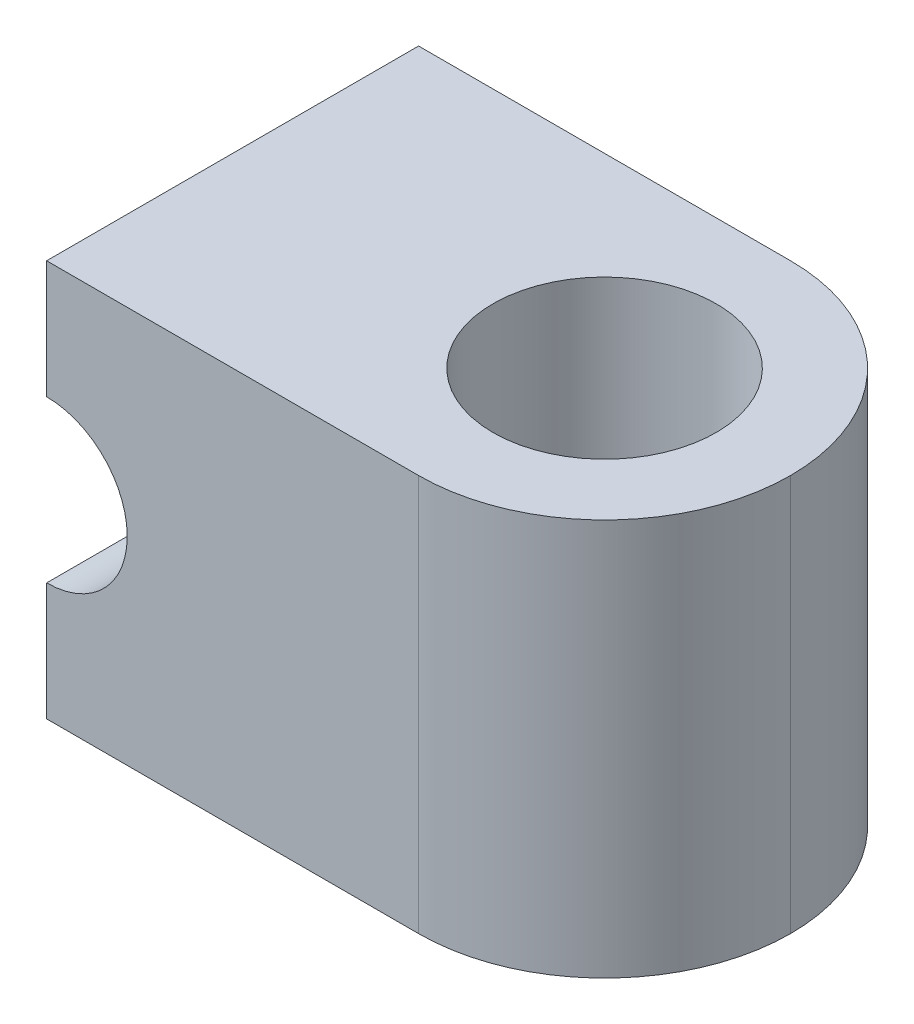
ISO-10303-21;
HEADER;
FILE_DESCRIPTION(('STEP AP214'),'2;1');
FILE_NAME('part.step','',(''),(''),'','','');
FILE_SCHEMA(('AUTOMOTIVE_DESIGN { 1 0 10303 214 1 1 1 1 }'));
ENDSEC;
DATA;
#1=APPLICATION_CONTEXT('core data for automotive mechanical design processes');
#2=APPLICATION_PROTOCOL_DEFINITION('international standard','automotive_design',2000,#1);
#3=PRODUCT_CONTEXT('',#1,'mechanical');
#4=PRODUCT('Part','Part','',(#3));
#5=PRODUCT_RELATED_PRODUCT_CATEGORY('part','',(#4));
#6=PRODUCT_DEFINITION_FORMATION('','',#4);
#7=PRODUCT_DEFINITION_CONTEXT('part definition',#1,'design');
#8=PRODUCT_DEFINITION('design','',#6,#7);
#9=PRODUCT_DEFINITION_SHAPE('','',#8);
#10=(LENGTH_UNIT() NAMED_UNIT(*) SI_UNIT(.MILLI.,.METRE.));
#11=(NAMED_UNIT(*) PLANE_ANGLE_UNIT() SI_UNIT($,.RADIAN.));
#12=(NAMED_UNIT(*) SI_UNIT($,.STERADIAN.) SOLID_ANGLE_UNIT());
#13=UNCERTAINTY_MEASURE_WITH_UNIT(LENGTH_MEASURE(1.E-05),#10,'distance_accuracy_value','');
#14=(GEOMETRIC_REPRESENTATION_CONTEXT(3) GLOBAL_UNCERTAINTY_ASSIGNED_CONTEXT((#13)) GLOBAL_UNIT_ASSIGNED_CONTEXT((#10,
#11,#12)) REPRESENTATION_CONTEXT('',''));
#15=CARTESIAN_POINT('',(0.,0.,0.));
#16=DIRECTION('',(0.,0.,1.));
#17=DIRECTION('',(1.,0.,0.));
#18=AXIS2_PLACEMENT_3D('',#15,#16,#17);
#19=CARTESIAN_POINT('',(0.,16.,0.));
#20=DIRECTION('',(1.,0.,0.));
#21=DIRECTION('',(0.,0.,-1.));
#22=AXIS2_PLACEMENT_3D('',#19,#20,#21);
#23=PLANE('',#22);
#24=DIRECTION('',(0.,0.,-1.));
#25=VECTOR('',#24,1.);
#26=CARTESIAN_POINT('',(0.,14.75,-2.75));
#27=LINE('',#26,#25);
#28=CARTESIAN_POINT('',(-8.00073649975432E-10,14.7499843075769,0.));
#29=VERTEX_POINT('',#28);
#30=CARTESIAN_POINT('',(-1.32589261149824E-09,14.7499854811122,-5.5));
#31=VERTEX_POINT('',#30);
#32=EDGE_CURVE('E316',#29,#31,#27,.T.);
#33=ORIENTED_EDGE('',*,*,#32,.F.);
#34=DIRECTION('',(0.,0.,1.));
#35=VECTOR('',#34,1.);
#36=CARTESIAN_POINT('',(0.,14.75,2.75));
#37=LINE('',#36,#35);
#38=CARTESIAN_POINT('',(-1.32589261149824E-09,14.7499854811122,5.5));
#39=VERTEX_POINT('',#38);
#40=EDGE_CURVE('E345',#29,#39,#37,.T.);
#41=ORIENTED_EDGE('',*,*,#40,.T.);
#42=DIRECTION('',(0.,-1.,0.));
#43=VECTOR('',#42,1.);
#44=CARTESIAN_POINT('',(0.,3.29378375834211,5.5));
#45=LINE('',#44,#43);
#46=CARTESIAN_POINT('',(9.04623059787926E-09,12.7499889953993,5.5));
#47=VERTEX_POINT('',#46);
#48=EDGE_CURVE('E136',#39,#47,#45,.T.);
#49=ORIENTED_EDGE('',*,*,#48,.T.);
#50=DIRECTION('',(0.,0.,-1.));
#51=VECTOR('',#50,1.);
#52=CARTESIAN_POINT('',(0.,12.75,2.75));
#53=LINE('',#52,#51);
#54=CARTESIAN_POINT('',(0.,12.7499894520855,0.));
#55=VERTEX_POINT('',#54);
#56=EDGE_CURVE('E158',#47,#55,#53,.T.);
#57=ORIENTED_EDGE('',*,*,#56,.T.);
#58=DIRECTION('',(0.,0.,1.));
#59=VECTOR('',#58,1.);
#60=CARTESIAN_POINT('',(0.,12.75,-2.75));
#61=LINE('',#60,#59);
#62=CARTESIAN_POINT('',(9.04623059787926E-09,12.7499889953993,-5.5));
#63=VERTEX_POINT('',#62);
#64=EDGE_CURVE('E434',#63,#55,#61,.T.);
#65=ORIENTED_EDGE('',*,*,#64,.F.);
#66=DIRECTION('',(0.,-1.,0.));
#67=VECTOR('',#66,1.);
#68=CARTESIAN_POINT('',(0.,3.29378375834211,-5.5));
#69=LINE('',#68,#67);
#70=EDGE_CURVE('E431',#31,#63,#69,.T.);
#71=ORIENTED_EDGE('',*,*,#70,.F.);
#72=EDGE_LOOP('',(#33,#41,#49,#57,#65,#71));
#73=FACE_BOUND('',#72,.T.);
#74=DIRECTION('',(0.,-1.,0.));
#75=VECTOR('',#74,1.);
#76=CARTESIAN_POINT('',(0.,16.,7.5));
#77=LINE('',#76,#75);
#78=CARTESIAN_POINT('',(0.,16.,7.5));
#79=VERTEX_POINT('',#78);
#80=CARTESIAN_POINT('',(0.,11.25,7.5));
#81=VERTEX_POINT('',#80);
#82=EDGE_CURVE('E319',#79,#81,#77,.T.);
#83=ORIENTED_EDGE('',*,*,#82,.F.);
#84=DIRECTION('',(0.,0.,1.));
#85=VECTOR('',#84,1.);
#86=CARTESIAN_POINT('',(0.,16.,0.));
#87=LINE('',#86,#85);
#88=CARTESIAN_POINT('',(0.,16.,-7.5));
#89=VERTEX_POINT('',#88);
#90=EDGE_CURVE('E211',#89,#79,#87,.T.);
#91=ORIENTED_EDGE('',*,*,#90,.F.);
#92=DIRECTION('',(0.,-1.,0.));
#93=VECTOR('',#92,1.);
#94=CARTESIAN_POINT('',(0.,16.,-7.5));
#95=LINE('',#94,#93);
#96=CARTESIAN_POINT('',(0.,11.25,-7.5));
#97=VERTEX_POINT('',#96);
#98=EDGE_CURVE('E208',#89,#97,#95,.T.);
#99=ORIENTED_EDGE('',*,*,#98,.T.);
#100=DIRECTION('',(0.,0.,1.));
#101=VECTOR('',#100,1.);
#102=CARTESIAN_POINT('',(0.,11.25,-7.5));
#103=LINE('',#102,#101);
#104=EDGE_CURVE('E222',#97,#81,#103,.T.);
#105=ORIENTED_EDGE('',*,*,#104,.T.);
#106=EDGE_LOOP('',(#83,#91,#99,#105));
#107=FACE_BOUND('',#106,.T.);
#108=ADVANCED_FACE('F33',(#73,#107),#23,.F.);
#109=DIRECTION('',(0.,0.,1.));
#110=VECTOR('',#109,1.);
#111=CARTESIAN_POINT('',(0.,0.,0.));
#112=LINE('',#111,#110);
#113=CARTESIAN_POINT('',(0.,0.,-7.5));
#114=VERTEX_POINT('',#113);
#115=CARTESIAN_POINT('',(0.,0.,7.5));
#116=VERTEX_POINT('',#115);
#117=EDGE_CURVE('E219',#114,#116,#112,.T.);
#118=ORIENTED_EDGE('',*,*,#117,.T.);
#119=CARTESIAN_POINT('',(0.,4.75,7.5));
#120=VERTEX_POINT('',#119);
#121=EDGE_CURVE('E322',#120,#116,#77,.T.);
#122=ORIENTED_EDGE('',*,*,#121,.F.);
#123=DIRECTION('',(0.,0.,1.));
#124=VECTOR('',#123,1.);
#125=CARTESIAN_POINT('',(0.,4.75,-7.5));
#126=LINE('',#125,#124);
#127=CARTESIAN_POINT('',(0.,4.75,-7.5));
#128=VERTEX_POINT('',#127);
#129=EDGE_CURVE('E251',#120,#128,#126,.F.);
#130=ORIENTED_EDGE('',*,*,#129,.T.);
#131=EDGE_CURVE('E210',#128,#114,#95,.T.);
#132=ORIENTED_EDGE('',*,*,#131,.T.);
#133=EDGE_LOOP('',(#118,#122,#130,#132));
#134=FACE_BOUND('',#133,.T.);
#135=DIRECTION('',(0.,0.,1.));
#136=VECTOR('',#135,1.);
#137=CARTESIAN_POINT('',(0.,1.24943477123403,2.75));
#138=LINE('',#137,#136);
#139=CARTESIAN_POINT('',(0.,1.24944337779133,5.5));
#140=VERTEX_POINT('',#139);
#141=CARTESIAN_POINT('',(0.,1.24943477123403,0.));
#142=VERTEX_POINT('',#141);
#143=EDGE_CURVE('E146',#140,#142,#138,.F.);
#144=ORIENTED_EDGE('',*,*,#143,.T.);
#145=DIRECTION('',(0.,0.,-1.));
#146=VECTOR('',#145,1.);
#147=CARTESIAN_POINT('',(0.,1.24943477123403,-2.75));
#148=LINE('',#147,#146);
#149=CARTESIAN_POINT('',(0.,1.24944337779133,-5.5));
#150=VERTEX_POINT('',#149);
#151=EDGE_CURVE('E248',#150,#142,#148,.F.);
#152=ORIENTED_EDGE('',*,*,#151,.F.);
#153=DIRECTION('',(0.,-1.,0.));
#154=VECTOR('',#153,1.);
#155=CARTESIAN_POINT('',(0.,3.29378375834211,-5.5));
#156=LINE('',#155,#154);
#157=CARTESIAN_POINT('',(0.,3.24993062658759,-5.5));
#158=VERTEX_POINT('',#157);
#159=EDGE_CURVE('E252',#158,#150,#156,.T.);
#160=ORIENTED_EDGE('',*,*,#159,.F.);
#161=DIRECTION('',(0.,0.,1.));
#162=VECTOR('',#161,1.);
#163=CARTESIAN_POINT('',(0.,3.24993062658759,-2.75));
#164=LINE('',#163,#162);
#165=CARTESIAN_POINT('',(-1.03447123439506E-08,3.24993510379351,0.));
#166=VERTEX_POINT('',#165);
#167=EDGE_CURVE('E253',#166,#158,#164,.F.);
#168=ORIENTED_EDGE('',*,*,#167,.F.);
#169=DIRECTION('',(0.,0.,-1.));
#170=VECTOR('',#169,1.);
#171=CARTESIAN_POINT('',(0.,3.24993062658759,2.75));
#172=LINE('',#171,#170);
#173=CARTESIAN_POINT('',(0.,3.24993062658759,5.5));
#174=VERTEX_POINT('',#173);
#175=EDGE_CURVE('E157',#166,#174,#172,.F.);
#176=ORIENTED_EDGE('',*,*,#175,.T.);
#177=DIRECTION('',(0.,-1.,0.));
#178=VECTOR('',#177,1.);
#179=CARTESIAN_POINT('',(0.,3.29378375834211,5.5));
#180=LINE('',#179,#178);
#181=EDGE_CURVE('E133',#174,#140,#180,.T.);
#182=ORIENTED_EDGE('',*,*,#181,.T.);
#183=EDGE_LOOP('',(#144,#152,#160,#168,#176,#182));
#184=FACE_BOUND('',#183,.T.);
#185=ADVANCED_FACE('F155',(#134,#184),#23,.F.);
#186=CARTESIAN_POINT('',(0.,16.,-7.5));
#187=DIRECTION('',(0.,0.,1.));
#188=DIRECTION('',(1.,0.,0.));
#189=AXIS2_PLACEMENT_3D('',#186,#187,#188);
#190=PLANE('',#189);
#191=DIRECTION('',(-1.,0.,0.));
#192=VECTOR('',#191,1.);
#193=CARTESIAN_POINT('',(0.,16.,-7.5));
#194=LINE('',#193,#192);
#195=CARTESIAN_POINT('',(15.,16.,-7.5));
#196=VERTEX_POINT('',#195);
#197=EDGE_CURVE('E201',#196,#89,#194,.T.);
#198=ORIENTED_EDGE('',*,*,#197,.F.);
#199=DIRECTION('',(0.,-1.,0.));
#200=VECTOR('',#199,1.);
#201=CARTESIAN_POINT('',(15.,16.,-7.5));
#202=LINE('',#201,#200);
#203=CARTESIAN_POINT('',(15.,0.,-7.5));
#204=VERTEX_POINT('',#203);
#205=EDGE_CURVE('E190',#196,#204,#202,.T.);
#206=ORIENTED_EDGE('',*,*,#205,.T.);
#207=DIRECTION('',(-1.,0.,0.));
#208=VECTOR('',#207,1.);
#209=CARTESIAN_POINT('',(0.,0.,-7.5));
#210=LINE('',#209,#208);
#211=EDGE_CURVE('E215',#204,#114,#210,.T.);
#212=ORIENTED_EDGE('',*,*,#211,.T.);
#213=ORIENTED_EDGE('',*,*,#131,.F.);
#214=CARTESIAN_POINT('',(0.,8.,-7.5));
#215=DIRECTION('',(0.,0.,1.));
#216=DIRECTION('',(1.,0.,0.));
#217=AXIS2_PLACEMENT_3D('',#214,#215,#216);
#218=CIRCLE('',#217,3.25);
#219=EDGE_CURVE('E193',#128,#97,#218,.T.);
#220=ORIENTED_EDGE('',*,*,#219,.T.);
#221=ORIENTED_EDGE('',*,*,#98,.F.);
#222=EDGE_LOOP('',(#198,#206,#212,#213,#220,#221));
#223=FACE_BOUND('',#222,.T.);
#224=ADVANCED_FACE('F204',(#223),#190,.F.);
#225=CARTESIAN_POINT('',(0.,16.,0.));
#226=DIRECTION('',(0.,-1.,0.));
#227=DIRECTION('',(0.,0.,-1.));
#228=AXIS2_PLACEMENT_3D('',#225,#226,#227);
#229=PLANE('',#228);
#230=CARTESIAN_POINT('',(15.,16.,0.));
#231=DIRECTION('',(0.,1.,0.));
#232=DIRECTION('',(0.,0.,1.));
#233=AXIS2_PLACEMENT_3D('',#230,#231,#232);
#234=CIRCLE('',#233,4.5);
#235=CARTESIAN_POINT('',(15.,16.,4.5));
#236=VERTEX_POINT('',#235);
#237=EDGE_CURVE('E175',#236,#236,#234,.T.);
#238=ORIENTED_EDGE('',*,*,#237,.F.);
#239=EDGE_LOOP('',(#238));
#240=FACE_BOUND('',#239,.T.);
#241=CARTESIAN_POINT('',(15.,16.,0.));
#242=DIRECTION('',(0.,-1.,0.));
#243=DIRECTION('',(0.,0.,-1.));
#244=AXIS2_PLACEMENT_3D('',#241,#242,#243);
#245=CIRCLE('',#244,7.5);
#246=CARTESIAN_POINT('',(15.,16.,7.5));
#247=VERTEX_POINT('',#246);
#248=CARTESIAN_POINT('',(22.5,16.,0.));
#249=VERTEX_POINT('',#248);
#250=EDGE_CURVE('E49',#247,#249,#245,.F.);
#251=ORIENTED_EDGE('',*,*,#250,.T.);
#252=CARTESIAN_POINT('',(15.,16.,0.));
#253=DIRECTION('',(0.,-1.,0.));
#254=DIRECTION('',(0.,0.,-1.));
#255=AXIS2_PLACEMENT_3D('',#252,#253,#254);
#256=CIRCLE('',#255,7.5);
#257=EDGE_CURVE('E42',#249,#196,#256,.F.);
#258=ORIENTED_EDGE('',*,*,#257,.T.);
#259=ORIENTED_EDGE('',*,*,#197,.T.);
#260=ORIENTED_EDGE('',*,*,#90,.T.);
#261=DIRECTION('',(-1.,0.,0.));
#262=VECTOR('',#261,1.);
#263=CARTESIAN_POINT('',(0.,16.,7.5));
#264=LINE('',#263,#262);
#265=EDGE_CURVE('E169',#247,#79,#264,.T.);
#266=ORIENTED_EDGE('',*,*,#265,.F.);
#267=EDGE_LOOP('',(#251,#258,#259,#260,#266));
#268=FACE_BOUND('',#267,.T.);
#269=ADVANCED_FACE('F199',(#240,#268),#229,.F.);
#270=CARTESIAN_POINT('',(0.,0.,0.));
#271=DIRECTION('',(0.,-1.,0.));
#272=DIRECTION('',(0.,0.,-1.));
#273=AXIS2_PLACEMENT_3D('',#270,#271,#272);
#274=PLANE('',#273);
#275=CARTESIAN_POINT('',(15.,0.,0.));
#276=DIRECTION('',(0.,1.,0.));
#277=DIRECTION('',(0.,0.,1.));
#278=AXIS2_PLACEMENT_3D('',#275,#276,#277);
#279=CIRCLE('',#278,4.5);
#280=CARTESIAN_POINT('',(15.,0.,4.5));
#281=VERTEX_POINT('',#280);
#282=EDGE_CURVE('E172',#281,#281,#279,.T.);
#283=ORIENTED_EDGE('',*,*,#282,.T.);
#284=EDGE_LOOP('',(#283));
#285=FACE_BOUND('',#284,.T.);
#286=ORIENTED_EDGE('',*,*,#211,.F.);
#287=CARTESIAN_POINT('',(15.,0.,0.));
#288=DIRECTION('',(0.,-1.,0.));
#289=DIRECTION('',(0.,0.,-1.));
#290=AXIS2_PLACEMENT_3D('',#287,#288,#289);
#291=CIRCLE('',#290,7.5);
#292=CARTESIAN_POINT('',(22.5,0.,0.));
#293=VERTEX_POINT('',#292);
#294=EDGE_CURVE('E184',#204,#293,#291,.T.);
#295=ORIENTED_EDGE('',*,*,#294,.T.);
#296=CARTESIAN_POINT('',(15.,0.,0.));
#297=DIRECTION('',(0.,-1.,0.));
#298=DIRECTION('',(0.,0.,-1.));
#299=AXIS2_PLACEMENT_3D('',#296,#297,#298);
#300=CIRCLE('',#299,7.5);
#301=CARTESIAN_POINT('',(15.,0.,7.5));
#302=VERTEX_POINT('',#301);
#303=EDGE_CURVE('E188',#293,#302,#300,.T.);
#304=ORIENTED_EDGE('',*,*,#303,.T.);
#305=DIRECTION('',(-1.,0.,0.));
#306=VECTOR('',#305,1.);
#307=CARTESIAN_POINT('',(0.,0.,7.5));
#308=LINE('',#307,#306);
#309=EDGE_CURVE('E153',#302,#116,#308,.T.);
#310=ORIENTED_EDGE('',*,*,#309,.T.);
#311=ORIENTED_EDGE('',*,*,#117,.F.);
#312=EDGE_LOOP('',(#286,#295,#304,#310,#311));
#313=FACE_BOUND('',#312,.T.);
#314=ADVANCED_FACE('F292',(#285,#313),#274,.T.);
#315=CARTESIAN_POINT('',(0.,8.,-7.5));
#316=DIRECTION('',(0.,0.,1.));
#317=DIRECTION('',(1.,0.,0.));
#318=AXIS2_PLACEMENT_3D('',#315,#316,#317);
#319=CYLINDRICAL_SURFACE('',#318,3.25);
#320=ORIENTED_EDGE('',*,*,#219,.F.);
#321=ORIENTED_EDGE('',*,*,#129,.F.);
#322=CARTESIAN_POINT('',(0.,8.,7.5));
#323=DIRECTION('',(0.,0.,1.));
#324=DIRECTION('',(1.,0.,0.));
#325=AXIS2_PLACEMENT_3D('',#322,#323,#324);
#326=CIRCLE('',#325,3.25);
#327=EDGE_CURVE('E229',#120,#81,#326,.T.);
#328=ORIENTED_EDGE('',*,*,#327,.T.);
#329=ORIENTED_EDGE('',*,*,#104,.F.);
#330=EDGE_LOOP('',(#320,#321,#328,#329));
#331=FACE_BOUND('',#330,.T.);
#332=ADVANCED_FACE('F280',(#331),#319,.F.);
#333=CARTESIAN_POINT('',(-1.1046719263255,1.29652468883296,0.));
#334=CARTESIAN_POINT('',(-0.66706390211055,1.2735905956954,0.));
#335=CARTESIAN_POINT('',(-0.151063193480859,1.22292480579836,0.));
#336=CARTESIAN_POINT('',(1.09342509521962,1.3100059493306,0.));
#337=CARTESIAN_POINT('',(1.78040760112191,1.44345664144982,0.));
#338=CARTESIAN_POINT('',(3.21438143758473,2.01453066286151,0.));
#339=CARTESIAN_POINT('',(3.96641703420322,2.45625023368051,0.));
#340=CARTESIAN_POINT('',(5.34287372316447,3.76688392931484,0.));
#341=CARTESIAN_POINT('',(5.95679178461494,4.63295532191204,0.));
#342=CARTESIAN_POINT('',(6.72555443727544,6.74015648967208,0.));
#343=CARTESIAN_POINT('',(6.85745288349424,7.94424079861624,0.));
#344=CARTESIAN_POINT('',(6.44950692291816,10.330582427598,0.));
#345=CARTESIAN_POINT('',(5.9190574607573,11.4450669497834,0.));
#346=CARTESIAN_POINT('',(4.43217279507541,13.2210759171864,0.));
#347=CARTESIAN_POINT('',(3.51724363086746,13.8459440421014,0.));
#348=CARTESIAN_POINT('',(1.68702694773135,14.6106031417987,0.));
#349=CARTESIAN_POINT('',(0.802645598054267,14.7500063884136,0.));
#350=CARTESIAN_POINT('',(-0.353827774004944,14.7499971838154,0.));
#351=CARTESIAN_POINT('',(-0.764243129078806,14.7213164432749,0.));
#352=CARTESIAN_POINT('',(-1.1046719263259,14.703475311167,0.));
#353=CARTESIAN_POINT('',(-1.1046719263255,1.29652468883296,-5.5));
#354=CARTESIAN_POINT('',(-0.66706390211055,1.2735905956954,-5.5));
#355=CARTESIAN_POINT('',(-0.151063193480859,1.22292480579836,-5.5));
#356=CARTESIAN_POINT('',(1.09342509521962,1.3100059493306,-5.5));
#357=CARTESIAN_POINT('',(1.78040760112191,1.44345664144982,-5.5));
#358=CARTESIAN_POINT('',(3.21438143758473,2.01453066286151,-5.5));
#359=CARTESIAN_POINT('',(3.96641703420322,2.45625023368051,-5.5));
#360=CARTESIAN_POINT('',(5.34287372316447,3.76688392931484,-5.5));
#361=CARTESIAN_POINT('',(5.95679178461494,4.63295532191204,-5.5));
#362=CARTESIAN_POINT('',(6.72555443727544,6.74015648967208,-5.5));
#363=CARTESIAN_POINT('',(6.85745288349424,7.94424079861624,-5.5));
#364=CARTESIAN_POINT('',(6.44950692291816,10.330582427598,-5.5));
#365=CARTESIAN_POINT('',(5.9190574607573,11.4450669497834,-5.5));
#366=CARTESIAN_POINT('',(4.43217279507541,13.2210759171864,-5.5));
#367=CARTESIAN_POINT('',(3.51724363086746,13.8459440421014,-5.5));
#368=CARTESIAN_POINT('',(1.68702694773135,14.6106031417987,-5.5));
#369=CARTESIAN_POINT('',(0.802645598054267,14.7500063884136,-5.5));
#370=CARTESIAN_POINT('',(-0.353827774004944,14.7499971838154,-5.5));
#371=CARTESIAN_POINT('',(-0.764243129078806,14.7213164432749,-5.5));
#372=CARTESIAN_POINT('',(-1.1046719263259,14.703475311167,-5.5));
#373=B_SPLINE_SURFACE_WITH_KNOTS('',1,3,((#333,#334,#335,#336,#337,#338,#339,#340,#341,#342,
#343,#344,#345,#346,#347,#348,#349,#350,#351,#352),(#353,#354,#355,#356,#357,#358,#359,#360,
#361,#362,#363,#364,#365,#366,#367,#368,#369,#370,#371,#372)),.UNSPECIFIED.,.F.,.F.,.F.,(2,2),
(4,2,2,2,2,2,2,2,2,4),(0.,1.),(0.,0.118471805117258,0.236943610234516,0.355415415351774,
0.473887220469031,0.592359025586289,0.710830830703547,0.829302635820805,0.947774440938063,1.),.UNSPECIFIED.);
#374=CARTESIAN_POINT('',(-1.1046719263255,1.29652468883296,0.));
#375=CARTESIAN_POINT('',(-0.66706390211055,1.2735905956954,0.));
#376=CARTESIAN_POINT('',(-0.151063193480859,1.22292480579836,0.));
#377=CARTESIAN_POINT('',(1.09342509521962,1.3100059493306,0.));
#378=CARTESIAN_POINT('',(1.78040760112191,1.44345664144982,0.));
#379=CARTESIAN_POINT('',(3.21438143758473,2.01453066286151,0.));
#380=CARTESIAN_POINT('',(3.96641703420322,2.45625023368051,0.));
#381=CARTESIAN_POINT('',(5.34287372316447,3.76688392931484,0.));
#382=CARTESIAN_POINT('',(5.95679178461494,4.63295532191204,0.));
#383=CARTESIAN_POINT('',(6.72555443727544,6.74015648967208,0.));
#384=CARTESIAN_POINT('',(6.85745288349424,7.94424079861624,0.));
#385=CARTESIAN_POINT('',(6.44950692291816,10.330582427598,0.));
#386=CARTESIAN_POINT('',(5.9190574607573,11.4450669497834,0.));
#387=CARTESIAN_POINT('',(4.43217279507541,13.2210759171864,0.));
#388=CARTESIAN_POINT('',(3.51724363086746,13.8459440421014,0.));
#389=CARTESIAN_POINT('',(1.68702694773135,14.6106031417987,0.));
#390=CARTESIAN_POINT('',(0.802645598054267,14.7500063884136,0.));
#391=CARTESIAN_POINT('',(-0.353827774004944,14.7499971838154,0.));
#392=CARTESIAN_POINT('',(-0.764243129078806,14.7213164432749,0.));
#393=CARTESIAN_POINT('',(-1.1046719263259,14.703475311167,0.));
#394=B_SPLINE_CURVE_WITH_KNOTS('',3,(#374,#375,#376,#377,#378,#379,#380,#381,#382,#383,#384,
#385,#386,#387,#388,#389,#390,#391,#392,#393),.UNSPECIFIED.,.F.,.F.,(4,2,2,2,2,2,2,2,2,4),(0.,
0.118471805117258,0.236943610234516,0.355415415351774,0.473887220469031,0.592359025586289,
0.710830830703547,0.829302635820805,0.947774440938063,1.),.UNSPECIFIED.);
#395=EDGE_CURVE('E141',#142,#29,#394,.T.);
#396=CARTESIAN_POINT('',(-1.1046719263255,1.29652468883296,-5.5));
#397=CARTESIAN_POINT('',(-0.66706390211055,1.2735905956954,-5.5));
#398=CARTESIAN_POINT('',(-0.151063193480859,1.22292480579836,-5.5));
#399=CARTESIAN_POINT('',(1.09342509521962,1.3100059493306,-5.5));
#400=CARTESIAN_POINT('',(1.78040760112191,1.44345664144982,-5.5));
#401=CARTESIAN_POINT('',(3.21438143758473,2.01453066286151,-5.5));
#402=CARTESIAN_POINT('',(3.96641703420322,2.45625023368051,-5.5));
#403=CARTESIAN_POINT('',(5.34287372316447,3.76688392931484,-5.5));
#404=CARTESIAN_POINT('',(5.95679178461494,4.63295532191204,-5.5));
#405=CARTESIAN_POINT('',(6.72555443727544,6.74015648967208,-5.5));
#406=CARTESIAN_POINT('',(6.85745288349424,7.94424079861624,-5.5));
#407=CARTESIAN_POINT('',(6.44950692291816,10.330582427598,-5.5));
#408=CARTESIAN_POINT('',(5.9190574607573,11.4450669497834,-5.5));
#409=CARTESIAN_POINT('',(4.43217279507541,13.2210759171864,-5.5));
#410=CARTESIAN_POINT('',(3.51724363086746,13.8459440421014,-5.5));
#411=CARTESIAN_POINT('',(1.68702694773135,14.6106031417987,-5.5));
#412=CARTESIAN_POINT('',(0.802645598054267,14.7500063884136,-5.5));
#413=CARTESIAN_POINT('',(-0.353827774004944,14.7499971838154,-5.5));
#414=CARTESIAN_POINT('',(-0.764243129078806,14.7213164432749,-5.5));
#415=CARTESIAN_POINT('',(-1.1046719263259,14.703475311167,-5.5));
#416=B_SPLINE_CURVE_WITH_KNOTS('',3,(#396,#397,#398,#399,#400,#401,#402,#403,#404,#405,#406,
#407,#408,#409,#410,#411,#412,#413,#414,#415),.UNSPECIFIED.,.F.,.F.,(4,2,2,2,2,2,2,2,2,4),(0.,
0.118471805117258,0.236943610234516,0.355415415351774,0.473887220469031,0.592359025586289,
0.710830830703547,0.829302635820805,0.947774440938063,1.),.UNSPECIFIED.);
#417=EDGE_CURVE('E225',#150,#31,#416,.T.);
#418=ORIENTED_EDGE('',*,*,#151,.T.);
#419=ORIENTED_EDGE('',*,*,#395,.T.);
#420=ORIENTED_EDGE('',*,*,#32,.T.);
#421=ORIENTED_EDGE('',*,*,#417,.F.);
#422=EDGE_LOOP('',(#418,#419,#420,#421));
#423=FACE_BOUND('',#422,.T.);
#424=ADVANCED_FACE('F267',(#423),#373,.F.);
#425=CARTESIAN_POINT('',(-1.00000001383971,3.29378375834211,-5.5));
#426=DIRECTION('',(0.,0.,-1.));
#427=DIRECTION('',(-1.,0.,0.));
#428=AXIS2_PLACEMENT_3D('',#425,#426,#427);
#429=PLANE('',#428);
#430=ORIENTED_EDGE('',*,*,#159,.T.);
#431=ORIENTED_EDGE('',*,*,#417,.T.);
#432=ORIENTED_EDGE('',*,*,#70,.T.);
#433=CARTESIAN_POINT('',(-1.00000001383971,3.29378375834211,-5.5));
#434=CARTESIAN_POINT('',(-0.494963794040662,3.2673158904002,-5.5));
#435=CARTESIAN_POINT('',(-0.106380038425631,3.23094149503594,-5.5));
#436=CARTESIAN_POINT('',(0.769523598908411,3.29223199931407,-5.5));
#437=CARTESIAN_POINT('',(1.25121260899728,3.38547253295367,-5.5));
#438=CARTESIAN_POINT('',(2.26363893675919,3.78866668119132,-5.5));
#439=CARTESIAN_POINT('',(2.79342630649176,4.10098001113884,-5.5));
#440=CARTESIAN_POINT('',(3.75755607832249,5.01900328874675,-5.5));
#441=CARTESIAN_POINT('',(4.19556634385984,5.64087848178356,-5.5));
#442=CARTESIAN_POINT('',(4.72904766413707,7.10316316340521,-5.5));
#443=CARTESIAN_POINT('',(4.82290714039532,7.9766012793386,-5.5));
#444=CARTESIAN_POINT('',(4.5412497604134,9.6242002502195,-5.5));
#445=CARTESIAN_POINT('',(4.15661698950936,10.4346339921158,-5.5));
#446=CARTESIAN_POINT('',(3.12758207940997,11.6637628401963,-5.5));
#447=CARTESIAN_POINT('',(2.47010313296212,12.1158996685471,-5.5));
#448=CARTESIAN_POINT('',(1.19216134827411,12.6498187201233,-5.5));
#449=CARTESIAN_POINT('',(0.547543703522425,12.7500029028018,-5.5));
#450=CARTESIAN_POINT('',(-0.241371995632205,12.7499987203669,-5.5));
#451=CARTESIAN_POINT('',(-0.645633274764971,12.7247878334458,-5.5));
#452=CARTESIAN_POINT('',(-1.00000001383993,12.7062162416579,-5.5));
#453=B_SPLINE_CURVE_WITH_KNOTS('',3,(#433,#434,#435,#436,#437,#438,#439,#440,#441,#442,#443,
#444,#445,#446,#447,#448,#449,#450,#451,#452),.UNSPECIFIED.,.F.,.F.,(4,2,2,2,2,2,2,2,2,4),(0.,
0.118471805117258,0.236943610234516,0.355415415351774,0.473887220469031,0.592359025586289,
0.710830830703547,0.829302635820805,0.947774440938063,1.),.UNSPECIFIED.);
#454=EDGE_CURVE('E228',#158,#63,#453,.T.);
#455=ORIENTED_EDGE('',*,*,#454,.F.);
#456=EDGE_LOOP('',(#430,#431,#432,#455));
#457=FACE_BOUND('',#456,.T.);
#458=ADVANCED_FACE('F279',(#457),#429,.F.);
#459=CARTESIAN_POINT('',(-1.00000001383971,3.29378375834211,-5.5));
#460=CARTESIAN_POINT('',(-0.494963794040662,3.2673158904002,-5.5));
#461=CARTESIAN_POINT('',(-0.106380038425631,3.23094149503594,-5.5));
#462=CARTESIAN_POINT('',(0.769523598908411,3.29223199931407,-5.5));
#463=CARTESIAN_POINT('',(1.25121260899728,3.38547253295367,-5.5));
#464=CARTESIAN_POINT('',(2.26363893675919,3.78866668119132,-5.5));
#465=CARTESIAN_POINT('',(2.79342630649176,4.10098001113884,-5.5));
#466=CARTESIAN_POINT('',(3.75755607832249,5.01900328874675,-5.5));
#467=CARTESIAN_POINT('',(4.19556634385984,5.64087848178356,-5.5));
#468=CARTESIAN_POINT('',(4.72904766413707,7.10316316340521,-5.5));
#469=CARTESIAN_POINT('',(4.82290714039532,7.9766012793386,-5.5));
#470=CARTESIAN_POINT('',(4.5412497604134,9.6242002502195,-5.5));
#471=CARTESIAN_POINT('',(4.15661698950936,10.4346339921158,-5.5));
#472=CARTESIAN_POINT('',(3.12758207940997,11.6637628401963,-5.5));
#473=CARTESIAN_POINT('',(2.47010313296212,12.1158996685471,-5.5));
#474=CARTESIAN_POINT('',(1.19216134827411,12.6498187201233,-5.5));
#475=CARTESIAN_POINT('',(0.547543703522425,12.7500029028018,-5.5));
#476=CARTESIAN_POINT('',(-0.241371995632205,12.7499987203669,-5.5));
#477=CARTESIAN_POINT('',(-0.645633274764971,12.7247878334458,-5.5));
#478=CARTESIAN_POINT('',(-1.00000001383993,12.7062162416579,-5.5));
#479=CARTESIAN_POINT('',(-1.00000001383971,3.29378375834211,0.));
#480=CARTESIAN_POINT('',(-0.494963794040662,3.2673158904002,0.));
#481=CARTESIAN_POINT('',(-0.106380038425631,3.23094149503594,0.));
#482=CARTESIAN_POINT('',(0.769523598908411,3.29223199931407,0.));
#483=CARTESIAN_POINT('',(1.25121260899728,3.38547253295367,0.));
#484=CARTESIAN_POINT('',(2.26363893675919,3.78866668119132,0.));
#485=CARTESIAN_POINT('',(2.79342630649176,4.10098001113884,0.));
#486=CARTESIAN_POINT('',(3.75755607832249,5.01900328874675,0.));
#487=CARTESIAN_POINT('',(4.19556634385984,5.64087848178356,0.));
#488=CARTESIAN_POINT('',(4.72904766413707,7.10316316340521,0.));
#489=CARTESIAN_POINT('',(4.82290714039532,7.9766012793386,0.));
#490=CARTESIAN_POINT('',(4.5412497604134,9.6242002502195,0.));
#491=CARTESIAN_POINT('',(4.15661698950936,10.4346339921158,0.));
#492=CARTESIAN_POINT('',(3.12758207940997,11.6637628401963,0.));
#493=CARTESIAN_POINT('',(2.47010313296212,12.1158996685471,0.));
#494=CARTESIAN_POINT('',(1.19216134827411,12.6498187201233,0.));
#495=CARTESIAN_POINT('',(0.547543703522425,12.7500029028018,0.));
#496=CARTESIAN_POINT('',(-0.241371995632205,12.7499987203669,0.));
#497=CARTESIAN_POINT('',(-0.645633274764971,12.7247878334458,0.));
#498=CARTESIAN_POINT('',(-1.00000001383993,12.7062162416579,0.));
#499=B_SPLINE_SURFACE_WITH_KNOTS('',1,3,((#459,#460,#461,#462,#463,#464,#465,#466,#467,#468,
#469,#470,#471,#472,#473,#474,#475,#476,#477,#478),(#479,#480,#481,#482,#483,#484,#485,#486,
#487,#488,#489,#490,#491,#492,#493,#494,#495,#496,#497,#498)),.UNSPECIFIED.,.F.,.F.,.F.,(2,2),
(4,2,2,2,2,2,2,2,2,4),(0.,1.),(0.,0.118471805117258,0.236943610234516,0.355415415351774,
0.473887220469031,0.592359025586289,0.710830830703547,0.829302635820805,0.947774440938063,1.),.UNSPECIFIED.);
#500=CARTESIAN_POINT('',(-1.00000001383971,3.29378375834211,0.));
#501=CARTESIAN_POINT('',(-0.494963794040662,3.2673158904002,0.));
#502=CARTESIAN_POINT('',(-0.106380038425631,3.23094149503594,0.));
#503=CARTESIAN_POINT('',(0.769523598908411,3.29223199931407,0.));
#504=CARTESIAN_POINT('',(1.25121260899728,3.38547253295367,0.));
#505=CARTESIAN_POINT('',(2.26363893675919,3.78866668119132,0.));
#506=CARTESIAN_POINT('',(2.79342630649176,4.10098001113884,0.));
#507=CARTESIAN_POINT('',(3.75755607832249,5.01900328874675,0.));
#508=CARTESIAN_POINT('',(4.19556634385984,5.64087848178356,0.));
#509=CARTESIAN_POINT('',(4.72904766413707,7.10316316340521,0.));
#510=CARTESIAN_POINT('',(4.82290714039532,7.9766012793386,0.));
#511=CARTESIAN_POINT('',(4.5412497604134,9.6242002502195,0.));
#512=CARTESIAN_POINT('',(4.15661698950936,10.4346339921158,0.));
#513=CARTESIAN_POINT('',(3.12758207940997,11.6637628401963,0.));
#514=CARTESIAN_POINT('',(2.47010313296212,12.1158996685471,0.));
#515=CARTESIAN_POINT('',(1.19216134827411,12.6498187201233,0.));
#516=CARTESIAN_POINT('',(0.547543703522425,12.7500029028018,0.));
#517=CARTESIAN_POINT('',(-0.241371995632205,12.7499987203669,0.));
#518=CARTESIAN_POINT('',(-0.645633274764971,12.7247878334458,0.));
#519=CARTESIAN_POINT('',(-1.00000001383993,12.7062162416579,0.));
#520=B_SPLINE_CURVE_WITH_KNOTS('',3,(#500,#501,#502,#503,#504,#505,#506,#507,#508,#509,#510,
#511,#512,#513,#514,#515,#516,#517,#518,#519),.UNSPECIFIED.,.F.,.F.,(4,2,2,2,2,2,2,2,2,4),(0.,
0.118471805117258,0.236943610234516,0.355415415351774,0.473887220469031,0.592359025586289,
0.710830830703547,0.829302635820805,0.947774440938063,1.),.UNSPECIFIED.);
#521=EDGE_CURVE('E344',#166,#55,#520,.T.);
#522=ORIENTED_EDGE('',*,*,#167,.T.);
#523=ORIENTED_EDGE('',*,*,#454,.T.);
#524=ORIENTED_EDGE('',*,*,#64,.T.);
#525=ORIENTED_EDGE('',*,*,#521,.F.);
#526=EDGE_LOOP('',(#522,#523,#524,#525));
#527=FACE_BOUND('',#526,.T.);
#528=ADVANCED_FACE('F294',(#527),#499,.F.);
#529=CARTESIAN_POINT('',(0.,16.,7.5));
#530=DIRECTION('',(0.,0.,-1.));
#531=DIRECTION('',(1.,0.,0.));
#532=AXIS2_PLACEMENT_3D('',#529,#530,#531);
#533=PLANE('',#532);
#534=ORIENTED_EDGE('',*,*,#309,.F.);
#535=DIRECTION('',(0.,-1.,0.));
#536=VECTOR('',#535,1.);
#537=CARTESIAN_POINT('',(15.,16.,7.5));
#538=LINE('',#537,#536);
#539=EDGE_CURVE('E11',#302,#247,#538,.F.);
#540=ORIENTED_EDGE('',*,*,#539,.T.);
#541=ORIENTED_EDGE('',*,*,#265,.T.);
#542=ORIENTED_EDGE('',*,*,#82,.T.);
#543=ORIENTED_EDGE('',*,*,#327,.F.);
#544=ORIENTED_EDGE('',*,*,#121,.T.);
#545=EDGE_LOOP('',(#534,#540,#541,#542,#543,#544));
#546=FACE_BOUND('',#545,.T.);
#547=ADVANCED_FACE('F281',(#546),#533,.F.);
#548=CARTESIAN_POINT('',(-1.1046719263255,1.29652468883296,0.));
#549=CARTESIAN_POINT('',(-0.66706390211055,1.2735905956954,0.));
#550=CARTESIAN_POINT('',(-0.151063193480859,1.22292480579836,0.));
#551=CARTESIAN_POINT('',(1.09342509521962,1.3100059493306,0.));
#552=CARTESIAN_POINT('',(1.78040760112191,1.44345664144982,0.));
#553=CARTESIAN_POINT('',(3.21438143758473,2.01453066286151,0.));
#554=CARTESIAN_POINT('',(3.96641703420322,2.45625023368051,0.));
#555=CARTESIAN_POINT('',(5.34287372316447,3.76688392931484,0.));
#556=CARTESIAN_POINT('',(5.95679178461494,4.63295532191204,0.));
#557=CARTESIAN_POINT('',(6.72555443727544,6.74015648967208,0.));
#558=CARTESIAN_POINT('',(6.85745288349424,7.94424079861624,0.));
#559=CARTESIAN_POINT('',(6.44950692291816,10.330582427598,0.));
#560=CARTESIAN_POINT('',(5.9190574607573,11.4450669497834,0.));
#561=CARTESIAN_POINT('',(4.43217279507541,13.2210759171864,0.));
#562=CARTESIAN_POINT('',(3.51724363086746,13.8459440421014,0.));
#563=CARTESIAN_POINT('',(1.68702694773135,14.6106031417987,0.));
#564=CARTESIAN_POINT('',(0.802645598054267,14.7500063884136,0.));
#565=CARTESIAN_POINT('',(-0.353827774004944,14.7499971838154,0.));
#566=CARTESIAN_POINT('',(-0.764243129078806,14.7213164432749,0.));
#567=CARTESIAN_POINT('',(-1.1046719263259,14.703475311167,0.));
#568=CARTESIAN_POINT('',(-1.1046719263255,1.29652468883296,5.5));
#569=CARTESIAN_POINT('',(-0.66706390211055,1.2735905956954,5.5));
#570=CARTESIAN_POINT('',(-0.151063193480859,1.22292480579836,5.5));
#571=CARTESIAN_POINT('',(1.09342509521962,1.3100059493306,5.5));
#572=CARTESIAN_POINT('',(1.78040760112191,1.44345664144982,5.5));
#573=CARTESIAN_POINT('',(3.21438143758473,2.01453066286151,5.5));
#574=CARTESIAN_POINT('',(3.96641703420322,2.45625023368051,5.5));
#575=CARTESIAN_POINT('',(5.34287372316447,3.76688392931484,5.5));
#576=CARTESIAN_POINT('',(5.95679178461494,4.63295532191204,5.5));
#577=CARTESIAN_POINT('',(6.72555443727544,6.74015648967208,5.5));
#578=CARTESIAN_POINT('',(6.85745288349424,7.94424079861624,5.5));
#579=CARTESIAN_POINT('',(6.44950692291816,10.330582427598,5.5));
#580=CARTESIAN_POINT('',(5.9190574607573,11.4450669497834,5.5));
#581=CARTESIAN_POINT('',(4.43217279507541,13.2210759171864,5.5));
#582=CARTESIAN_POINT('',(3.51724363086746,13.8459440421014,5.5));
#583=CARTESIAN_POINT('',(1.68702694773135,14.6106031417987,5.5));
#584=CARTESIAN_POINT('',(0.802645598054267,14.7500063884136,5.5));
#585=CARTESIAN_POINT('',(-0.353827774004944,14.7499971838154,5.5));
#586=CARTESIAN_POINT('',(-0.764243129078806,14.7213164432749,5.5));
#587=CARTESIAN_POINT('',(-1.1046719263259,14.703475311167,5.5));
#588=B_SPLINE_SURFACE_WITH_KNOTS('',1,3,((#548,#549,#550,#551,#552,#553,#554,#555,#556,#557,
#558,#559,#560,#561,#562,#563,#564,#565,#566,#567),(#568,#569,#570,#571,#572,#573,#574,#575,
#576,#577,#578,#579,#580,#581,#582,#583,#584,#585,#586,#587)),.UNSPECIFIED.,.F.,.F.,.F.,(2,2),
(4,2,2,2,2,2,2,2,2,4),(0.,1.),(0.,0.118471805117258,0.236943610234516,0.355415415351774,
0.473887220469031,0.592359025586289,0.710830830703547,0.829302635820805,0.947774440938063,1.),.UNSPECIFIED.);
#589=CARTESIAN_POINT('',(-1.1046719263255,1.29652468883296,5.5));
#590=CARTESIAN_POINT('',(-0.66706390211055,1.2735905956954,5.5));
#591=CARTESIAN_POINT('',(-0.151063193480859,1.22292480579836,5.5));
#592=CARTESIAN_POINT('',(1.09342509521962,1.3100059493306,5.5));
#593=CARTESIAN_POINT('',(1.78040760112191,1.44345664144982,5.5));
#594=CARTESIAN_POINT('',(3.21438143758473,2.01453066286151,5.5));
#595=CARTESIAN_POINT('',(3.96641703420322,2.45625023368051,5.5));
#596=CARTESIAN_POINT('',(5.34287372316447,3.76688392931484,5.5));
#597=CARTESIAN_POINT('',(5.95679178461494,4.63295532191204,5.5));
#598=CARTESIAN_POINT('',(6.72555443727544,6.74015648967208,5.5));
#599=CARTESIAN_POINT('',(6.85745288349424,7.94424079861624,5.5));
#600=CARTESIAN_POINT('',(6.44950692291816,10.330582427598,5.5));
#601=CARTESIAN_POINT('',(5.9190574607573,11.4450669497834,5.5));
#602=CARTESIAN_POINT('',(4.43217279507541,13.2210759171864,5.5));
#603=CARTESIAN_POINT('',(3.51724363086746,13.8459440421014,5.5));
#604=CARTESIAN_POINT('',(1.68702694773135,14.6106031417987,5.5));
#605=CARTESIAN_POINT('',(0.802645598054267,14.7500063884136,5.5));
#606=CARTESIAN_POINT('',(-0.353827774004944,14.7499971838154,5.5));
#607=CARTESIAN_POINT('',(-0.764243129078806,14.7213164432749,5.5));
#608=CARTESIAN_POINT('',(-1.1046719263259,14.703475311167,5.5));
#609=B_SPLINE_CURVE_WITH_KNOTS('',3,(#589,#590,#591,#592,#593,#594,#595,#596,#597,#598,#599,
#600,#601,#602,#603,#604,#605,#606,#607,#608),.UNSPECIFIED.,.F.,.F.,(4,2,2,2,2,2,2,2,2,4),(0.,
0.118471805117258,0.236943610234516,0.355415415351774,0.473887220469031,0.592359025586289,
0.710830830703547,0.829302635820805,0.947774440938063,1.),.UNSPECIFIED.);
#610=EDGE_CURVE('E128',#140,#39,#609,.T.);
#611=ORIENTED_EDGE('',*,*,#143,.F.);
#612=ORIENTED_EDGE('',*,*,#610,.T.);
#613=ORIENTED_EDGE('',*,*,#40,.F.);
#614=ORIENTED_EDGE('',*,*,#395,.F.);
#615=EDGE_LOOP('',(#611,#612,#613,#614));
#616=FACE_BOUND('',#615,.T.);
#617=ADVANCED_FACE('F147',(#616),#588,.T.);
#618=CARTESIAN_POINT('',(-1.00000001383971,3.29378375834211,5.5));
#619=DIRECTION('',(0.,0.,1.));
#620=DIRECTION('',(-1.,0.,0.));
#621=AXIS2_PLACEMENT_3D('',#618,#619,#620);
#622=PLANE('',#621);
#623=ORIENTED_EDGE('',*,*,#181,.F.);
#624=CARTESIAN_POINT('',(-1.00000001383971,3.29378375834211,5.5));
#625=CARTESIAN_POINT('',(-0.494963794040662,3.2673158904002,5.5));
#626=CARTESIAN_POINT('',(-0.106380038425631,3.23094149503594,5.5));
#627=CARTESIAN_POINT('',(0.769523598908411,3.29223199931407,5.5));
#628=CARTESIAN_POINT('',(1.25121260899728,3.38547253295367,5.5));
#629=CARTESIAN_POINT('',(2.26363893675919,3.78866668119132,5.5));
#630=CARTESIAN_POINT('',(2.79342630649176,4.10098001113884,5.5));
#631=CARTESIAN_POINT('',(3.75755607832249,5.01900328874675,5.5));
#632=CARTESIAN_POINT('',(4.19556634385984,5.64087848178356,5.5));
#633=CARTESIAN_POINT('',(4.72904766413707,7.10316316340521,5.5));
#634=CARTESIAN_POINT('',(4.82290714039532,7.9766012793386,5.5));
#635=CARTESIAN_POINT('',(4.5412497604134,9.6242002502195,5.5));
#636=CARTESIAN_POINT('',(4.15661698950936,10.4346339921158,5.5));
#637=CARTESIAN_POINT('',(3.12758207940997,11.6637628401963,5.5));
#638=CARTESIAN_POINT('',(2.47010313296212,12.1158996685471,5.5));
#639=CARTESIAN_POINT('',(1.19216134827411,12.6498187201233,5.5));
#640=CARTESIAN_POINT('',(0.547543703522425,12.7500029028018,5.5));
#641=CARTESIAN_POINT('',(-0.241371995632205,12.7499987203669,5.5));
#642=CARTESIAN_POINT('',(-0.645633274764971,12.7247878334458,5.5));
#643=CARTESIAN_POINT('',(-1.00000001383993,12.7062162416579,5.5));
#644=B_SPLINE_CURVE_WITH_KNOTS('',3,(#624,#625,#626,#627,#628,#629,#630,#631,#632,#633,#634,
#635,#636,#637,#638,#639,#640,#641,#642,#643),.UNSPECIFIED.,.F.,.F.,(4,2,2,2,2,2,2,2,2,4),(0.,
0.118471805117258,0.236943610234516,0.355415415351774,0.473887220469031,0.592359025586289,
0.710830830703547,0.829302635820805,0.947774440938063,1.),.UNSPECIFIED.);
#645=EDGE_CURVE('E140',#174,#47,#644,.T.);
#646=ORIENTED_EDGE('',*,*,#645,.T.);
#647=ORIENTED_EDGE('',*,*,#48,.F.);
#648=ORIENTED_EDGE('',*,*,#610,.F.);
#649=EDGE_LOOP('',(#623,#646,#647,#648));
#650=FACE_BOUND('',#649,.T.);
#651=ADVANCED_FACE('F131',(#650),#622,.F.);
#652=CARTESIAN_POINT('',(-1.00000001383971,3.29378375834211,5.5));
#653=CARTESIAN_POINT('',(-0.494963794040662,3.2673158904002,5.5));
#654=CARTESIAN_POINT('',(-0.106380038425631,3.23094149503594,5.5));
#655=CARTESIAN_POINT('',(0.769523598908411,3.29223199931407,5.5));
#656=CARTESIAN_POINT('',(1.25121260899728,3.38547253295367,5.5));
#657=CARTESIAN_POINT('',(2.26363893675919,3.78866668119132,5.5));
#658=CARTESIAN_POINT('',(2.79342630649176,4.10098001113884,5.5));
#659=CARTESIAN_POINT('',(3.75755607832249,5.01900328874675,5.5));
#660=CARTESIAN_POINT('',(4.19556634385984,5.64087848178356,5.5));
#661=CARTESIAN_POINT('',(4.72904766413707,7.10316316340521,5.5));
#662=CARTESIAN_POINT('',(4.82290714039532,7.9766012793386,5.5));
#663=CARTESIAN_POINT('',(4.5412497604134,9.6242002502195,5.5));
#664=CARTESIAN_POINT('',(4.15661698950936,10.4346339921158,5.5));
#665=CARTESIAN_POINT('',(3.12758207940997,11.6637628401963,5.5));
#666=CARTESIAN_POINT('',(2.47010313296212,12.1158996685471,5.5));
#667=CARTESIAN_POINT('',(1.19216134827411,12.6498187201233,5.5));
#668=CARTESIAN_POINT('',(0.547543703522425,12.7500029028018,5.5));
#669=CARTESIAN_POINT('',(-0.241371995632205,12.7499987203669,5.5));
#670=CARTESIAN_POINT('',(-0.645633274764971,12.7247878334458,5.5));
#671=CARTESIAN_POINT('',(-1.00000001383993,12.7062162416579,5.5));
#672=CARTESIAN_POINT('',(-1.00000001383971,3.29378375834211,0.));
#673=CARTESIAN_POINT('',(-0.494963794040662,3.2673158904002,0.));
#674=CARTESIAN_POINT('',(-0.106380038425631,3.23094149503594,0.));
#675=CARTESIAN_POINT('',(0.769523598908411,3.29223199931407,0.));
#676=CARTESIAN_POINT('',(1.25121260899728,3.38547253295367,0.));
#677=CARTESIAN_POINT('',(2.26363893675919,3.78866668119132,0.));
#678=CARTESIAN_POINT('',(2.79342630649176,4.10098001113884,0.));
#679=CARTESIAN_POINT('',(3.75755607832249,5.01900328874675,0.));
#680=CARTESIAN_POINT('',(4.19556634385984,5.64087848178356,0.));
#681=CARTESIAN_POINT('',(4.72904766413707,7.10316316340521,0.));
#682=CARTESIAN_POINT('',(4.82290714039532,7.9766012793386,0.));
#683=CARTESIAN_POINT('',(4.5412497604134,9.6242002502195,0.));
#684=CARTESIAN_POINT('',(4.15661698950936,10.4346339921158,0.));
#685=CARTESIAN_POINT('',(3.12758207940997,11.6637628401963,0.));
#686=CARTESIAN_POINT('',(2.47010313296212,12.1158996685471,0.));
#687=CARTESIAN_POINT('',(1.19216134827411,12.6498187201233,0.));
#688=CARTESIAN_POINT('',(0.547543703522425,12.7500029028018,0.));
#689=CARTESIAN_POINT('',(-0.241371995632205,12.7499987203669,0.));
#690=CARTESIAN_POINT('',(-0.645633274764971,12.7247878334458,0.));
#691=CARTESIAN_POINT('',(-1.00000001383993,12.7062162416579,0.));
#692=B_SPLINE_SURFACE_WITH_KNOTS('',1,3,((#652,#653,#654,#655,#656,#657,#658,#659,#660,#661,
#662,#663,#664,#665,#666,#667,#668,#669,#670,#671),(#672,#673,#674,#675,#676,#677,#678,#679,
#680,#681,#682,#683,#684,#685,#686,#687,#688,#689,#690,#691)),.UNSPECIFIED.,.F.,.F.,.F.,(2,2),
(4,2,2,2,2,2,2,2,2,4),(0.,1.),(0.,0.118471805117258,0.236943610234516,0.355415415351774,
0.473887220469031,0.592359025586289,0.710830830703547,0.829302635820805,0.947774440938063,1.),.UNSPECIFIED.);
#693=ORIENTED_EDGE('',*,*,#175,.F.);
#694=ORIENTED_EDGE('',*,*,#521,.T.);
#695=ORIENTED_EDGE('',*,*,#56,.F.);
#696=ORIENTED_EDGE('',*,*,#645,.F.);
#697=EDGE_LOOP('',(#693,#694,#695,#696));
#698=FACE_BOUND('',#697,.T.);
#699=ADVANCED_FACE('F455',(#698),#692,.T.);
#700=CARTESIAN_POINT('',(15.,16.,0.));
#701=DIRECTION('',(0.,1.,0.));
#702=DIRECTION('',(0.,0.,1.));
#703=AXIS2_PLACEMENT_3D('',#700,#701,#702);
#704=CYLINDRICAL_SURFACE('',#703,4.5);
#705=ORIENTED_EDGE('',*,*,#282,.F.);
#706=EDGE_LOOP('',(#705));
#707=FACE_BOUND('',#706,.T.);
#708=ORIENTED_EDGE('',*,*,#237,.T.);
#709=EDGE_LOOP('',(#708));
#710=FACE_BOUND('',#709,.T.);
#711=ADVANCED_FACE('F309',(#707,#710),#704,.F.);
#712=CARTESIAN_POINT('',(15.,16.,0.));
#713=DIRECTION('',(0.,-1.,0.));
#714=DIRECTION('',(0.,0.,-1.));
#715=AXIS2_PLACEMENT_3D('',#712,#713,#714);
#716=CYLINDRICAL_SURFACE('',#715,7.5);
#717=DIRECTION('',(0.,-1.,0.));
#718=VECTOR('',#717,1.);
#719=CARTESIAN_POINT('',(22.5,16.,0.));
#720=LINE('',#719,#718);
#721=EDGE_CURVE('E37',#249,#293,#720,.T.);
#722=ORIENTED_EDGE('',*,*,#721,.F.);
#723=ORIENTED_EDGE('',*,*,#250,.F.);
#724=ORIENTED_EDGE('',*,*,#539,.F.);
#725=ORIENTED_EDGE('',*,*,#303,.F.);
#726=EDGE_LOOP('',(#722,#723,#724,#725));
#727=FACE_BOUND('',#726,.T.);
#728=ADVANCED_FACE('F35',(#727),#716,.T.);
#729=CARTESIAN_POINT('',(15.,16.,0.));
#730=DIRECTION('',(0.,-1.,0.));
#731=DIRECTION('',(0.,0.,-1.));
#732=AXIS2_PLACEMENT_3D('',#729,#730,#731);
#733=CYLINDRICAL_SURFACE('',#732,7.5);
#734=ORIENTED_EDGE('',*,*,#257,.F.);
#735=ORIENTED_EDGE('',*,*,#721,.T.);
#736=ORIENTED_EDGE('',*,*,#294,.F.);
#737=ORIENTED_EDGE('',*,*,#205,.F.);
#738=EDGE_LOOP('',(#734,#735,#736,#737));
#739=FACE_BOUND('',#738,.T.);
#740=ADVANCED_FACE('F182',(#739),#733,.T.);
#741=CLOSED_SHELL('',(#108,#185,#224,#269,#314,#332,#424,#458,#528,#547,#617,#651,#699,#711,
#728,#740));
#742=MANIFOLD_SOLID_BREP('B2',#741);
#743=ADVANCED_BREP_SHAPE_REPRESENTATION('',(#18,#742),#14);
#744=SHAPE_DEFINITION_REPRESENTATION(#9,#743);
ENDSEC;
END-ISO-10303-21;
